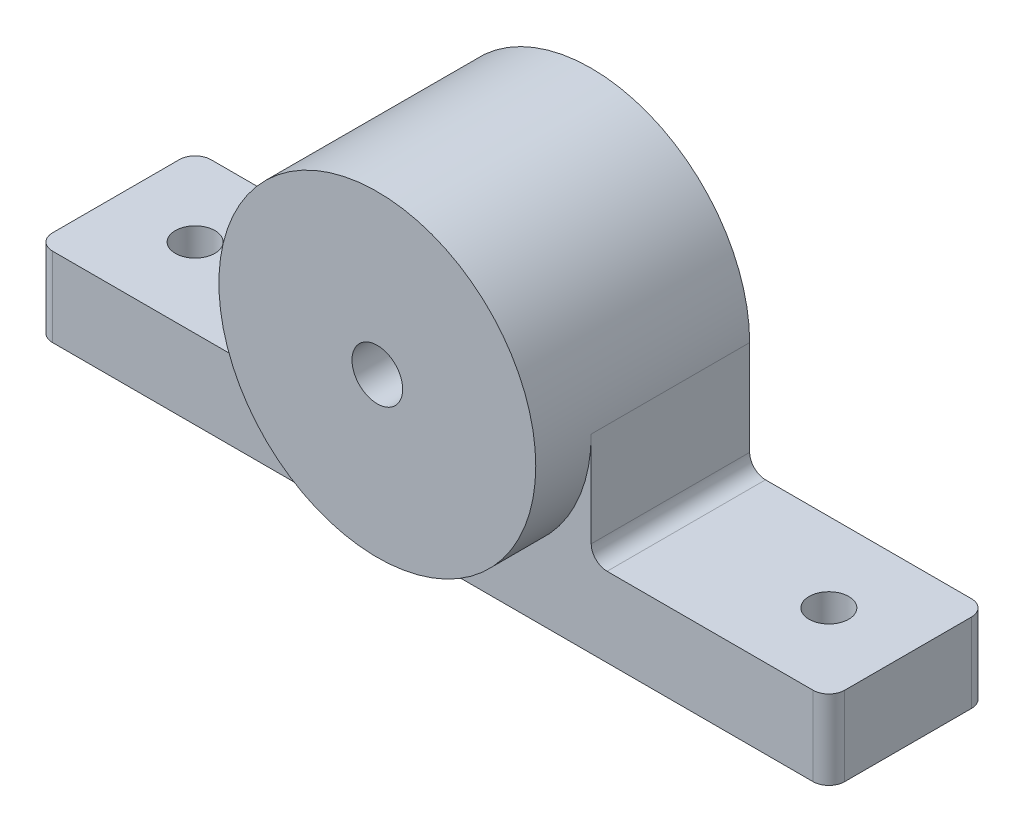
ISO-10303-21;
HEADER;
FILE_DESCRIPTION(('STEP AP214'),'2;1');
FILE_NAME('part.step','',(''),(''),'','','');
FILE_SCHEMA(('AUTOMOTIVE_DESIGN { 1 0 10303 214 1 1 1 1 }'));
ENDSEC;
DATA;
#1=APPLICATION_CONTEXT('core data for automotive mechanical design processes');
#2=APPLICATION_PROTOCOL_DEFINITION('international standard','automotive_design',2000,#1);
#3=PRODUCT_CONTEXT('',#1,'mechanical');
#4=PRODUCT('Part','Part','',(#3));
#5=PRODUCT_RELATED_PRODUCT_CATEGORY('part','',(#4));
#6=PRODUCT_DEFINITION_FORMATION('','',#4);
#7=PRODUCT_DEFINITION_CONTEXT('part definition',#1,'design');
#8=PRODUCT_DEFINITION('design','',#6,#7);
#9=PRODUCT_DEFINITION_SHAPE('','',#8);
#10=(LENGTH_UNIT() NAMED_UNIT(*) SI_UNIT(.MILLI.,.METRE.));
#11=(NAMED_UNIT(*) PLANE_ANGLE_UNIT() SI_UNIT($,.RADIAN.));
#12=(NAMED_UNIT(*) SI_UNIT($,.STERADIAN.) SOLID_ANGLE_UNIT());
#13=UNCERTAINTY_MEASURE_WITH_UNIT(LENGTH_MEASURE(1.E-05),#10,'distance_accuracy_value','');
#14=(GEOMETRIC_REPRESENTATION_CONTEXT(3) GLOBAL_UNCERTAINTY_ASSIGNED_CONTEXT((#13)) GLOBAL_UNIT_ASSIGNED_CONTEXT((#10,
#11,#12)) REPRESENTATION_CONTEXT('',''));
#15=CARTESIAN_POINT('',(0.,0.,0.));
#16=DIRECTION('',(0.,0.,1.));
#17=DIRECTION('',(1.,0.,0.));
#18=AXIS2_PLACEMENT_3D('',#15,#16,#17);
#19=CARTESIAN_POINT('',(0.,0.,0.));
#20=DIRECTION('',(0.,0.,1.));
#21=DIRECTION('',(1.,0.,0.));
#22=AXIS2_PLACEMENT_3D('',#19,#20,#21);
#23=PLANE('',#22);
#24=CARTESIAN_POINT('',(0.,0.,0.));
#25=DIRECTION('',(0.,0.,1.));
#26=DIRECTION('',(1.,0.,0.));
#27=AXIS2_PLACEMENT_3D('',#24,#25,#26);
#28=CIRCLE('',#27,5.);
#29=CARTESIAN_POINT('',(5.,0.,0.));
#30=VERTEX_POINT('',#29);
#31=EDGE_CURVE('E165',#30,#30,#28,.T.);
#32=ORIENTED_EDGE('',*,*,#31,.T.);
#33=EDGE_LOOP('',(#32));
#34=FACE_BOUND('',#33,.T.);
#35=CARTESIAN_POINT('',(0.,0.,0.));
#36=DIRECTION('',(0.,0.,1.));
#37=DIRECTION('',(1.,0.,0.));
#38=AXIS2_PLACEMENT_3D('',#35,#36,#37);
#39=CIRCLE('',#38,6.);
#40=CARTESIAN_POINT('',(6.,0.,0.));
#41=VERTEX_POINT('',#40);
#42=EDGE_CURVE('E164',#41,#41,#39,.T.);
#43=ORIENTED_EDGE('',*,*,#42,.F.);
#44=EDGE_LOOP('',(#43));
#45=FACE_BOUND('',#44,.T.);
#46=ADVANCED_FACE('F38',(#34,#45),#23,.F.);
#47=CARTESIAN_POINT('',(0.,0.,7.));
#48=DIRECTION('',(0.,0.,-1.));
#49=DIRECTION('',(-1.,0.,0.));
#50=AXIS2_PLACEMENT_3D('',#47,#48,#49);
#51=CYLINDRICAL_SURFACE('',#50,5.);
#52=CARTESIAN_POINT('',(0.,0.,7.));
#53=DIRECTION('',(0.,0.,1.));
#54=DIRECTION('',(1.,0.,0.));
#55=AXIS2_PLACEMENT_3D('',#52,#53,#54);
#56=CIRCLE('',#55,5.);
#57=CARTESIAN_POINT('',(5.,0.,7.));
#58=VERTEX_POINT('',#57);
#59=EDGE_CURVE('E173',#58,#58,#56,.T.);
#60=ORIENTED_EDGE('',*,*,#59,.T.);
#61=EDGE_LOOP('',(#60));
#62=FACE_BOUND('',#61,.T.);
#63=ORIENTED_EDGE('',*,*,#31,.F.);
#64=EDGE_LOOP('',(#63));
#65=FACE_BOUND('',#64,.T.);
#66=ADVANCED_FACE('F339',(#62,#65),#51,.F.);
#67=CARTESIAN_POINT('',(0.,0.,7.));
#68=DIRECTION('',(0.,0.,1.));
#69=DIRECTION('',(1.,0.,0.));
#70=AXIS2_PLACEMENT_3D('',#67,#68,#69);
#71=PLANE('',#70);
#72=CARTESIAN_POINT('',(0.,0.,7.));
#73=DIRECTION('',(0.,0.,-1.));
#74=DIRECTION('',(-1.,0.,0.));
#75=AXIS2_PLACEMENT_3D('',#72,#73,#74);
#76=CIRCLE('',#75,1.6);
#77=CARTESIAN_POINT('',(-1.6,0.,7.));
#78=VERTEX_POINT('',#77);
#79=EDGE_CURVE('E262',#78,#78,#76,.T.);
#80=ORIENTED_EDGE('',*,*,#79,.F.);
#81=EDGE_LOOP('',(#80));
#82=FACE_BOUND('',#81,.T.);
#83=ORIENTED_EDGE('',*,*,#59,.F.);
#84=EDGE_LOOP('',(#83));
#85=FACE_BOUND('',#84,.T.);
#86=ADVANCED_FACE('F345',(#82,#85),#71,.F.);
#87=CARTESIAN_POINT('',(0.,0.,8.5));
#88=DIRECTION('',(0.,0.,-1.));
#89=DIRECTION('',(-1.,0.,0.));
#90=AXIS2_PLACEMENT_3D('',#87,#88,#89);
#91=CYLINDRICAL_SURFACE('',#90,6.);
#92=CARTESIAN_POINT('',(0.,0.,-1.5));
#93=DIRECTION('',(0.,0.,-1.));
#94=DIRECTION('',(-1.,0.,0.));
#95=AXIS2_PLACEMENT_3D('',#92,#93,#94);
#96=CIRCLE('',#95,6.);
#97=CARTESIAN_POINT('',(-6.,0.,-1.5));
#98=VERTEX_POINT('',#97);
#99=EDGE_CURVE('E277',#98,#98,#96,.T.);
#100=ORIENTED_EDGE('',*,*,#99,.T.);
#101=EDGE_LOOP('',(#100));
#102=FACE_BOUND('',#101,.T.);
#103=ORIENTED_EDGE('',*,*,#42,.T.);
#104=EDGE_LOOP('',(#103));
#105=FACE_BOUND('',#104,.T.);
#106=ADVANCED_FACE('F508',(#102,#105),#91,.F.);
#107=CARTESIAN_POINT('',(-10.,-12.,8.5));
#108=DIRECTION('',(-1.,0.,0.));
#109=DIRECTION('',(0.,0.,1.));
#110=AXIS2_PLACEMENT_3D('',#107,#108,#109);
#111=PLANE('',#110);
#112=DIRECTION('',(0.,1.,0.));
#113=VECTOR('',#112,1.);
#114=CARTESIAN_POINT('',(-10.,-12.,-1.5));
#115=LINE('',#114,#113);
#116=CARTESIAN_POINT('',(-10.,-6.,-1.5));
#117=VERTEX_POINT('',#116);
#118=CARTESIAN_POINT('',(-10.,0.,-1.5));
#119=VERTEX_POINT('',#118);
#120=EDGE_CURVE('E177',#117,#119,#115,.T.);
#121=ORIENTED_EDGE('',*,*,#120,.F.);
#122=DIRECTION('',(0.,0.,-1.));
#123=VECTOR('',#122,1.);
#124=CARTESIAN_POINT('',(-10.,-6.,8.5));
#125=LINE('',#124,#123);
#126=CARTESIAN_POINT('',(-10.,-6.,8.5));
#127=VERTEX_POINT('',#126);
#128=EDGE_CURVE('E150',#117,#127,#125,.F.);
#129=ORIENTED_EDGE('',*,*,#128,.T.);
#130=DIRECTION('',(0.,1.,0.));
#131=VECTOR('',#130,1.);
#132=CARTESIAN_POINT('',(-10.,-12.,8.5));
#133=LINE('',#132,#131);
#134=CARTESIAN_POINT('',(-10.,0.,8.5));
#135=VERTEX_POINT('',#134);
#136=EDGE_CURVE('E142',#127,#135,#133,.T.);
#137=ORIENTED_EDGE('',*,*,#136,.T.);
#138=DIRECTION('',(0.,0.,-1.));
#139=VECTOR('',#138,1.);
#140=CARTESIAN_POINT('',(-10.,0.,8.5));
#141=LINE('',#140,#139);
#142=EDGE_CURVE('E147',#135,#119,#141,.T.);
#143=ORIENTED_EDGE('',*,*,#142,.T.);
#144=EDGE_LOOP('',(#121,#129,#137,#143));
#145=FACE_BOUND('',#144,.T.);
#146=ADVANCED_FACE('F145',(#145),#111,.T.);
#147=CARTESIAN_POINT('',(10.,-12.,8.5));
#148=DIRECTION('',(0.,-1.,0.));
#149=DIRECTION('',(0.,0.,-1.));
#150=AXIS2_PLACEMENT_3D('',#147,#148,#149);
#151=PLANE('',#150);
#152=CARTESIAN_POINT('',(-20.,-12.,3.5));
#153=DIRECTION('',(0.,-1.,0.));
#154=DIRECTION('',(0.,0.,-1.));
#155=AXIS2_PLACEMENT_3D('',#152,#153,#154);
#156=CIRCLE('',#155,1.25);
#157=CARTESIAN_POINT('',(-20.,-12.,2.25));
#158=VERTEX_POINT('',#157);
#159=EDGE_CURVE('E234',#158,#158,#156,.T.);
#160=ORIENTED_EDGE('',*,*,#159,.F.);
#161=EDGE_LOOP('',(#160));
#162=FACE_BOUND('',#161,.T.);
#163=CARTESIAN_POINT('',(-7.5,-12.,3.5));
#164=DIRECTION('',(0.,-1.,0.));
#165=DIRECTION('',(0.,0.,-1.));
#166=AXIS2_PLACEMENT_3D('',#163,#164,#165);
#167=CIRCLE('',#166,1.25);
#168=CARTESIAN_POINT('',(-7.5,-12.,2.25));
#169=VERTEX_POINT('',#168);
#170=EDGE_CURVE('E240',#169,#169,#167,.T.);
#171=ORIENTED_EDGE('',*,*,#170,.F.);
#172=EDGE_LOOP('',(#171));
#173=FACE_BOUND('',#172,.T.);
#174=CARTESIAN_POINT('',(7.5,-12.,3.5));
#175=DIRECTION('',(0.,-1.,0.));
#176=DIRECTION('',(0.,0.,1.));
#177=AXIS2_PLACEMENT_3D('',#174,#175,#176);
#178=CIRCLE('',#177,1.25);
#179=CARTESIAN_POINT('',(7.5,-12.,4.75));
#180=VERTEX_POINT('',#179);
#181=EDGE_CURVE('E253',#180,#180,#178,.T.);
#182=ORIENTED_EDGE('',*,*,#181,.F.);
#183=EDGE_LOOP('',(#182));
#184=FACE_BOUND('',#183,.T.);
#185=CARTESIAN_POINT('',(20.,-12.,3.50000000000001));
#186=DIRECTION('',(0.,-1.,0.));
#187=DIRECTION('',(0.,0.,1.));
#188=AXIS2_PLACEMENT_3D('',#185,#186,#187);
#189=CIRCLE('',#188,1.25);
#190=CARTESIAN_POINT('',(20.,-12.,4.75000000000001));
#191=VERTEX_POINT('',#190);
#192=EDGE_CURVE('E259',#191,#191,#189,.T.);
#193=ORIENTED_EDGE('',*,*,#192,.F.);
#194=EDGE_LOOP('',(#193));
#195=FACE_BOUND('',#194,.T.);
#196=DIRECTION('',(-1.,0.,0.));
#197=VECTOR('',#196,1.);
#198=CARTESIAN_POINT('',(10.,-12.,8.5));
#199=LINE('',#198,#197);
#200=CARTESIAN_POINT('',(24.,-12.,8.5));
#201=VERTEX_POINT('',#200);
#202=CARTESIAN_POINT('',(-24.,-12.,8.5));
#203=VERTEX_POINT('',#202);
#204=EDGE_CURVE('E154',#201,#203,#199,.T.);
#205=ORIENTED_EDGE('',*,*,#204,.T.);
#206=CARTESIAN_POINT('',(-24.,-12.,7.5));
#207=DIRECTION('',(0.,-1.,0.));
#208=DIRECTION('',(0.,0.,-1.));
#209=AXIS2_PLACEMENT_3D('',#206,#207,#208);
#210=CIRCLE('',#209,1.);
#211=CARTESIAN_POINT('',(-25.,-12.,7.5));
#212=VERTEX_POINT('',#211);
#213=EDGE_CURVE('E63',#203,#212,#210,.T.);
#214=ORIENTED_EDGE('',*,*,#213,.T.);
#215=DIRECTION('',(0.,0.,-1.));
#216=VECTOR('',#215,1.);
#217=CARTESIAN_POINT('',(-25.,-12.,-1.5));
#218=LINE('',#217,#216);
#219=CARTESIAN_POINT('',(-25.,-12.,-0.5));
#220=VERTEX_POINT('',#219);
#221=EDGE_CURVE('E267',#212,#220,#218,.T.);
#222=ORIENTED_EDGE('',*,*,#221,.T.);
#223=CARTESIAN_POINT('',(-24.,-12.,-0.5));
#224=DIRECTION('',(0.,-1.,0.));
#225=DIRECTION('',(0.,0.,-1.));
#226=AXIS2_PLACEMENT_3D('',#223,#224,#225);
#227=CIRCLE('',#226,1.);
#228=CARTESIAN_POINT('',(-24.,-12.,-1.5));
#229=VERTEX_POINT('',#228);
#230=EDGE_CURVE('E55',#220,#229,#227,.T.);
#231=ORIENTED_EDGE('',*,*,#230,.T.);
#232=DIRECTION('',(-1.,0.,0.));
#233=VECTOR('',#232,1.);
#234=CARTESIAN_POINT('',(10.,-12.,-1.5));
#235=LINE('',#234,#233);
#236=CARTESIAN_POINT('',(24.,-12.,-1.5));
#237=VERTEX_POINT('',#236);
#238=EDGE_CURVE('E288',#237,#229,#235,.T.);
#239=ORIENTED_EDGE('',*,*,#238,.F.);
#240=CARTESIAN_POINT('',(24.,-12.,-0.5));
#241=DIRECTION('',(0.,-1.,0.));
#242=DIRECTION('',(0.,0.,-1.));
#243=AXIS2_PLACEMENT_3D('',#240,#241,#242);
#244=CIRCLE('',#243,1.);
#245=CARTESIAN_POINT('',(25.,-12.,-0.5));
#246=VERTEX_POINT('',#245);
#247=EDGE_CURVE('E210',#237,#246,#244,.T.);
#248=ORIENTED_EDGE('',*,*,#247,.T.);
#249=DIRECTION('',(0.,0.,1.));
#250=VECTOR('',#249,1.);
#251=CARTESIAN_POINT('',(25.,-12.,-1.5));
#252=LINE('',#251,#250);
#253=CARTESIAN_POINT('',(25.,-12.,7.5));
#254=VERTEX_POINT('',#253);
#255=EDGE_CURVE('E238',#246,#254,#252,.T.);
#256=ORIENTED_EDGE('',*,*,#255,.T.);
#257=CARTESIAN_POINT('',(24.,-12.,7.5));
#258=DIRECTION('',(0.,-1.,0.));
#259=DIRECTION('',(0.,0.,-1.));
#260=AXIS2_PLACEMENT_3D('',#257,#258,#259);
#261=CIRCLE('',#260,1.);
#262=EDGE_CURVE('E208',#254,#201,#261,.T.);
#263=ORIENTED_EDGE('',*,*,#262,.T.);
#264=EDGE_LOOP('',(#205,#214,#222,#231,#239,#248,#256,#263));
#265=FACE_BOUND('',#264,.T.);
#266=ADVANCED_FACE('F309',(#162,#173,#184,#195,#265),#151,.T.);
#267=CARTESIAN_POINT('',(10.,0.,8.5));
#268=DIRECTION('',(1.,0.,0.));
#269=DIRECTION('',(0.,0.,-1.));
#270=AXIS2_PLACEMENT_3D('',#267,#268,#269);
#271=PLANE('',#270);
#272=DIRECTION('',(0.,-1.,0.));
#273=VECTOR('',#272,1.);
#274=CARTESIAN_POINT('',(10.,0.,8.5));
#275=LINE('',#274,#273);
#276=CARTESIAN_POINT('',(10.,0.,8.5));
#277=VERTEX_POINT('',#276);
#278=CARTESIAN_POINT('',(10.,-6.,8.5));
#279=VERTEX_POINT('',#278);
#280=EDGE_CURVE('E162',#277,#279,#275,.T.);
#281=ORIENTED_EDGE('',*,*,#280,.T.);
#282=DIRECTION('',(0.,0.,1.));
#283=VECTOR('',#282,1.);
#284=CARTESIAN_POINT('',(10.,-6.,-1.5));
#285=LINE('',#284,#283);
#286=CARTESIAN_POINT('',(10.,-6.,-1.5));
#287=VERTEX_POINT('',#286);
#288=EDGE_CURVE('E193',#279,#287,#285,.F.);
#289=ORIENTED_EDGE('',*,*,#288,.T.);
#290=DIRECTION('',(0.,-1.,0.));
#291=VECTOR('',#290,1.);
#292=CARTESIAN_POINT('',(10.,0.,-1.5));
#293=LINE('',#292,#291);
#294=CARTESIAN_POINT('',(10.,0.,-1.5));
#295=VERTEX_POINT('',#294);
#296=EDGE_CURVE('E286',#295,#287,#293,.T.);
#297=ORIENTED_EDGE('',*,*,#296,.F.);
#298=DIRECTION('',(0.,0.,-1.));
#299=VECTOR('',#298,1.);
#300=CARTESIAN_POINT('',(10.,0.,8.5));
#301=LINE('',#300,#299);
#302=EDGE_CURVE('E153',#277,#295,#301,.T.);
#303=ORIENTED_EDGE('',*,*,#302,.F.);
#304=EDGE_LOOP('',(#281,#289,#297,#303));
#305=FACE_BOUND('',#304,.T.);
#306=ADVANCED_FACE('F402',(#305),#271,.T.);
#307=CARTESIAN_POINT('',(0.,0.,8.5));
#308=DIRECTION('',(0.,0.,-1.));
#309=DIRECTION('',(-1.,0.,0.));
#310=AXIS2_PLACEMENT_3D('',#307,#308,#309);
#311=PLANE('',#310);
#312=DIRECTION('',(-1.,0.,0.));
#313=VECTOR('',#312,1.);
#314=CARTESIAN_POINT('',(-25.,-7.,8.5));
#315=LINE('',#314,#313);
#316=CARTESIAN_POINT('',(-11.,-7.,8.5));
#317=VERTEX_POINT('',#316);
#318=CARTESIAN_POINT('',(-24.,-7.,8.5));
#319=VERTEX_POINT('',#318);
#320=EDGE_CURVE('E266',#317,#319,#315,.T.);
#321=ORIENTED_EDGE('',*,*,#320,.T.);
#322=DIRECTION('',(0.,-1.,0.));
#323=VECTOR('',#322,1.);
#324=CARTESIAN_POINT('',(-24.,-12.,8.5));
#325=LINE('',#324,#323);
#326=EDGE_CURVE('E205',#319,#203,#325,.T.);
#327=ORIENTED_EDGE('',*,*,#326,.T.);
#328=ORIENTED_EDGE('',*,*,#204,.F.);
#329=DIRECTION('',(0.,-1.,0.));
#330=VECTOR('',#329,1.);
#331=CARTESIAN_POINT('',(24.,-7.,8.5));
#332=LINE('',#331,#330);
#333=CARTESIAN_POINT('',(24.,-7.,8.5));
#334=VERTEX_POINT('',#333);
#335=EDGE_CURVE('E203',#201,#334,#332,.F.);
#336=ORIENTED_EDGE('',*,*,#335,.T.);
#337=CARTESIAN_POINT('',(11.,-7.,8.5));
#338=VERTEX_POINT('',#337);
#339=EDGE_CURVE('E269',#334,#338,#315,.T.);
#340=ORIENTED_EDGE('',*,*,#339,.T.);
#341=CARTESIAN_POINT('',(11.,-6.,8.5));
#342=DIRECTION('',(0.,0.,-1.));
#343=DIRECTION('',(-1.,0.,0.));
#344=AXIS2_PLACEMENT_3D('',#341,#342,#343);
#345=CIRCLE('',#344,1.);
#346=EDGE_CURVE('E228',#338,#279,#345,.T.);
#347=ORIENTED_EDGE('',*,*,#346,.T.);
#348=ORIENTED_EDGE('',*,*,#280,.F.);
#349=CARTESIAN_POINT('',(0.,0.,8.5));
#350=DIRECTION('',(0.,0.,-1.));
#351=DIRECTION('',(-1.,0.,0.));
#352=AXIS2_PLACEMENT_3D('',#349,#350,#351);
#353=CIRCLE('',#352,10.);
#354=EDGE_CURVE('E158',#277,#135,#353,.T.);
#355=ORIENTED_EDGE('',*,*,#354,.T.);
#356=ORIENTED_EDGE('',*,*,#136,.F.);
#357=CARTESIAN_POINT('',(-11.,-6.,8.5));
#358=DIRECTION('',(0.,0.,-1.));
#359=DIRECTION('',(-1.,0.,0.));
#360=AXIS2_PLACEMENT_3D('',#357,#358,#359);
#361=CIRCLE('',#360,1.);
#362=EDGE_CURVE('E11',#127,#317,#361,.T.);
#363=ORIENTED_EDGE('',*,*,#362,.T.);
#364=EDGE_LOOP('',(#321,#327,#328,#336,#340,#347,#348,#355,#356,#363));
#365=FACE_BOUND('',#364,.T.);
#366=ADVANCED_FACE('F160',(#365),#311,.F.);
#367=CARTESIAN_POINT('',(0.,0.,-1.5));
#368=DIRECTION('',(0.,0.,-1.));
#369=DIRECTION('',(-1.,0.,0.));
#370=AXIS2_PLACEMENT_3D('',#367,#368,#369);
#371=PLANE('',#370);
#372=ORIENTED_EDGE('',*,*,#238,.T.);
#373=DIRECTION('',(0.,-1.,0.));
#374=VECTOR('',#373,1.);
#375=CARTESIAN_POINT('',(-24.,0.,-1.5));
#376=LINE('',#375,#374);
#377=CARTESIAN_POINT('',(-24.,-7.,-1.5));
#378=VERTEX_POINT('',#377);
#379=EDGE_CURVE('E221',#229,#378,#376,.F.);
#380=ORIENTED_EDGE('',*,*,#379,.T.);
#381=DIRECTION('',(1.,0.,0.));
#382=VECTOR('',#381,1.);
#383=CARTESIAN_POINT('',(-25.,-7.,-1.5));
#384=LINE('',#383,#382);
#385=CARTESIAN_POINT('',(-11.,-7.,-1.5));
#386=VERTEX_POINT('',#385);
#387=EDGE_CURVE('E274',#378,#386,#384,.T.);
#388=ORIENTED_EDGE('',*,*,#387,.T.);
#389=CARTESIAN_POINT('',(-11.,-6.,-1.5));
#390=DIRECTION('',(0.,0.,-1.));
#391=DIRECTION('',(-1.,0.,0.));
#392=AXIS2_PLACEMENT_3D('',#389,#390,#391);
#393=CIRCLE('',#392,1.);
#394=EDGE_CURVE('E47',#386,#117,#393,.F.);
#395=ORIENTED_EDGE('',*,*,#394,.T.);
#396=ORIENTED_EDGE('',*,*,#120,.T.);
#397=CARTESIAN_POINT('',(0.,0.,-1.5));
#398=DIRECTION('',(0.,0.,-1.));
#399=DIRECTION('',(-1.,0.,0.));
#400=AXIS2_PLACEMENT_3D('',#397,#398,#399);
#401=CIRCLE('',#400,10.);
#402=EDGE_CURVE('E169',#119,#295,#401,.T.);
#403=ORIENTED_EDGE('',*,*,#402,.T.);
#404=ORIENTED_EDGE('',*,*,#296,.T.);
#405=CARTESIAN_POINT('',(11.,-6.,-1.5));
#406=DIRECTION('',(0.,0.,-1.));
#407=DIRECTION('',(-1.,0.,0.));
#408=AXIS2_PLACEMENT_3D('',#405,#406,#407);
#409=CIRCLE('',#408,1.);
#410=CARTESIAN_POINT('',(11.,-7.,-1.5));
#411=VERTEX_POINT('',#410);
#412=EDGE_CURVE('E230',#287,#411,#409,.F.);
#413=ORIENTED_EDGE('',*,*,#412,.T.);
#414=CARTESIAN_POINT('',(24.,-7.,-1.5));
#415=VERTEX_POINT('',#414);
#416=EDGE_CURVE('E273',#411,#415,#384,.T.);
#417=ORIENTED_EDGE('',*,*,#416,.T.);
#418=DIRECTION('',(0.,-1.,0.));
#419=VECTOR('',#418,1.);
#420=CARTESIAN_POINT('',(24.,0.,-1.5));
#421=LINE('',#420,#419);
#422=EDGE_CURVE('E218',#415,#237,#421,.T.);
#423=ORIENTED_EDGE('',*,*,#422,.T.);
#424=EDGE_LOOP('',(#372,#380,#388,#395,#396,#403,#404,#413,#417,#423));
#425=FACE_BOUND('',#424,.T.);
#426=ORIENTED_EDGE('',*,*,#99,.F.);
#427=EDGE_LOOP('',(#426));
#428=FACE_BOUND('',#427,.T.);
#429=ADVANCED_FACE('F292',(#425,#428),#371,.T.);
#430=CARTESIAN_POINT('',(0.,0.,12.));
#431=DIRECTION('',(0.,0.,1.));
#432=DIRECTION('',(1.,0.,0.));
#433=AXIS2_PLACEMENT_3D('',#430,#431,#432);
#434=PLANE('',#433);
#435=CARTESIAN_POINT('',(0.,0.,12.));
#436=DIRECTION('',(0.,0.,1.));
#437=DIRECTION('',(1.,0.,0.));
#438=AXIS2_PLACEMENT_3D('',#435,#436,#437);
#439=CIRCLE('',#438,1.6);
#440=CARTESIAN_POINT('',(1.6,0.,12.));
#441=VERTEX_POINT('',#440);
#442=EDGE_CURVE('E248',#441,#441,#439,.F.);
#443=ORIENTED_EDGE('',*,*,#442,.T.);
#444=EDGE_LOOP('',(#443));
#445=FACE_BOUND('',#444,.T.);
#446=CARTESIAN_POINT('',(0.,0.,12.));
#447=DIRECTION('',(0.,0.,1.));
#448=DIRECTION('',(1.,0.,0.));
#449=AXIS2_PLACEMENT_3D('',#446,#447,#448);
#450=CIRCLE('',#449,10.);
#451=CARTESIAN_POINT('',(10.,0.,12.));
#452=VERTEX_POINT('',#451);
#453=EDGE_CURVE('E170',#452,#452,#450,.T.);
#454=ORIENTED_EDGE('',*,*,#453,.T.);
#455=EDGE_LOOP('',(#454));
#456=FACE_BOUND('',#455,.T.);
#457=ADVANCED_FACE('F353',(#445,#456),#434,.T.);
#458=CARTESIAN_POINT('',(0.,0.,7.));
#459=DIRECTION('',(0.,0.,-1.));
#460=DIRECTION('',(-1.,0.,0.));
#461=AXIS2_PLACEMENT_3D('',#458,#459,#460);
#462=CYLINDRICAL_SURFACE('',#461,10.);
#463=ORIENTED_EDGE('',*,*,#453,.F.);
#464=EDGE_LOOP('',(#463));
#465=FACE_BOUND('',#464,.T.);
#466=ORIENTED_EDGE('',*,*,#354,.F.);
#467=ORIENTED_EDGE('',*,*,#302,.T.);
#468=ORIENTED_EDGE('',*,*,#402,.F.);
#469=ORIENTED_EDGE('',*,*,#142,.F.);
#470=EDGE_LOOP('',(#466,#467,#468,#469));
#471=FACE_BOUND('',#470,.T.);
#472=ADVANCED_FACE('F167',(#465,#471),#462,.T.);
#473=CARTESIAN_POINT('',(25.,-7.,-1.5));
#474=DIRECTION('',(1.,0.,0.));
#475=DIRECTION('',(0.,0.,-1.));
#476=AXIS2_PLACEMENT_3D('',#473,#474,#475);
#477=PLANE('',#476);
#478=ORIENTED_EDGE('',*,*,#255,.F.);
#479=DIRECTION('',(0.,-1.,0.));
#480=VECTOR('',#479,1.);
#481=CARTESIAN_POINT('',(25.,-7.,-0.5));
#482=LINE('',#481,#480);
#483=CARTESIAN_POINT('',(25.,-7.,-0.5));
#484=VERTEX_POINT('',#483);
#485=EDGE_CURVE('E226',#246,#484,#482,.F.);
#486=ORIENTED_EDGE('',*,*,#485,.T.);
#487=DIRECTION('',(0.,0.,1.));
#488=VECTOR('',#487,1.);
#489=CARTESIAN_POINT('',(25.,-7.,-1.5));
#490=LINE('',#489,#488);
#491=CARTESIAN_POINT('',(25.,-7.,7.5));
#492=VERTEX_POINT('',#491);
#493=EDGE_CURVE('E263',#484,#492,#490,.T.);
#494=ORIENTED_EDGE('',*,*,#493,.T.);
#495=DIRECTION('',(0.,-1.,0.));
#496=VECTOR('',#495,1.);
#497=CARTESIAN_POINT('',(25.,-12.,7.5));
#498=LINE('',#497,#496);
#499=EDGE_CURVE('E223',#492,#254,#498,.T.);
#500=ORIENTED_EDGE('',*,*,#499,.T.);
#501=EDGE_LOOP('',(#478,#486,#494,#500));
#502=FACE_BOUND('',#501,.T.);
#503=ADVANCED_FACE('F315',(#502),#477,.T.);
#504=CARTESIAN_POINT('',(0.,-7.,0.));
#505=DIRECTION('',(0.,1.,0.));
#506=DIRECTION('',(0.,0.,1.));
#507=AXIS2_PLACEMENT_3D('',#504,#505,#506);
#508=PLANE('',#507);
#509=CARTESIAN_POINT('',(20.,-7.,3.50000000000001));
#510=DIRECTION('',(0.,1.,0.));
#511=DIRECTION('',(0.,0.,1.));
#512=AXIS2_PLACEMENT_3D('',#509,#510,#511);
#513=CIRCLE('',#512,1.25);
#514=CARTESIAN_POINT('',(20.,-7.,4.75000000000001));
#515=VERTEX_POINT('',#514);
#516=EDGE_CURVE('E42',#515,#515,#513,.T.);
#517=ORIENTED_EDGE('',*,*,#516,.F.);
#518=EDGE_LOOP('',(#517));
#519=FACE_BOUND('',#518,.T.);
#520=ORIENTED_EDGE('',*,*,#416,.F.);
#521=DIRECTION('',(0.,0.,1.));
#522=VECTOR('',#521,1.);
#523=CARTESIAN_POINT('',(11.,-7.,8.5));
#524=LINE('',#523,#522);
#525=EDGE_CURVE('E190',#411,#338,#524,.T.);
#526=ORIENTED_EDGE('',*,*,#525,.T.);
#527=ORIENTED_EDGE('',*,*,#339,.F.);
#528=CARTESIAN_POINT('',(24.,-7.,7.5));
#529=DIRECTION('',(0.,1.,0.));
#530=DIRECTION('',(0.,0.,1.));
#531=AXIS2_PLACEMENT_3D('',#528,#529,#530);
#532=CIRCLE('',#531,1.);
#533=EDGE_CURVE('E186',#334,#492,#532,.T.);
#534=ORIENTED_EDGE('',*,*,#533,.T.);
#535=ORIENTED_EDGE('',*,*,#493,.F.);
#536=CARTESIAN_POINT('',(24.,-7.,-0.5));
#537=DIRECTION('',(0.,1.,0.));
#538=DIRECTION('',(0.,0.,1.));
#539=AXIS2_PLACEMENT_3D('',#536,#537,#538);
#540=CIRCLE('',#539,1.);
#541=EDGE_CURVE('E188',#484,#415,#540,.T.);
#542=ORIENTED_EDGE('',*,*,#541,.T.);
#543=EDGE_LOOP('',(#520,#526,#527,#534,#535,#542));
#544=FACE_BOUND('',#543,.T.);
#545=ADVANCED_FACE('F321',(#519,#544),#508,.T.);
#546=CARTESIAN_POINT('',(-20.,-7.,3.5));
#547=DIRECTION('',(0.,1.,0.));
#548=DIRECTION('',(0.,0.,1.));
#549=AXIS2_PLACEMENT_3D('',#546,#547,#548);
#550=CIRCLE('',#549,1.25);
#551=CARTESIAN_POINT('',(-20.,-7.,4.75));
#552=VERTEX_POINT('',#551);
#553=EDGE_CURVE('E232',#552,#552,#550,.T.);
#554=ORIENTED_EDGE('',*,*,#553,.F.);
#555=EDGE_LOOP('',(#554));
#556=FACE_BOUND('',#555,.T.);
#557=ORIENTED_EDGE('',*,*,#320,.F.);
#558=DIRECTION('',(0.,0.,-1.));
#559=VECTOR('',#558,1.);
#560=CARTESIAN_POINT('',(-11.,-7.,-1.5));
#561=LINE('',#560,#559);
#562=EDGE_CURVE('E199',#317,#386,#561,.T.);
#563=ORIENTED_EDGE('',*,*,#562,.T.);
#564=ORIENTED_EDGE('',*,*,#387,.F.);
#565=CARTESIAN_POINT('',(-24.,-7.,-0.5));
#566=DIRECTION('',(0.,1.,0.));
#567=DIRECTION('',(0.,0.,1.));
#568=AXIS2_PLACEMENT_3D('',#565,#566,#567);
#569=CIRCLE('',#568,1.);
#570=CARTESIAN_POINT('',(-25.,-7.,-0.5));
#571=VERTEX_POINT('',#570);
#572=EDGE_CURVE('E195',#378,#571,#569,.T.);
#573=ORIENTED_EDGE('',*,*,#572,.T.);
#574=DIRECTION('',(0.,0.,-1.));
#575=VECTOR('',#574,1.);
#576=CARTESIAN_POINT('',(-25.,-7.,-1.5));
#577=LINE('',#576,#575);
#578=CARTESIAN_POINT('',(-25.,-7.,7.5));
#579=VERTEX_POINT('',#578);
#580=EDGE_CURVE('E270',#579,#571,#577,.T.);
#581=ORIENTED_EDGE('',*,*,#580,.F.);
#582=CARTESIAN_POINT('',(-24.,-7.,7.5));
#583=DIRECTION('',(0.,1.,0.));
#584=DIRECTION('',(0.,0.,1.));
#585=AXIS2_PLACEMENT_3D('',#582,#583,#584);
#586=CIRCLE('',#585,1.);
#587=EDGE_CURVE('E197',#579,#319,#586,.T.);
#588=ORIENTED_EDGE('',*,*,#587,.T.);
#589=EDGE_LOOP('',(#557,#563,#564,#573,#581,#588));
#590=FACE_BOUND('',#589,.T.);
#591=ADVANCED_FACE('F300',(#556,#590),#508,.T.);
#592=CARTESIAN_POINT('',(-25.,-7.,-1.5));
#593=DIRECTION('',(-1.,0.,0.));
#594=DIRECTION('',(0.,0.,1.));
#595=AXIS2_PLACEMENT_3D('',#592,#593,#594);
#596=PLANE('',#595);
#597=ORIENTED_EDGE('',*,*,#221,.F.);
#598=DIRECTION('',(0.,-1.,0.));
#599=VECTOR('',#598,1.);
#600=CARTESIAN_POINT('',(-25.,-7.,7.5));
#601=LINE('',#600,#599);
#602=EDGE_CURVE('E216',#212,#579,#601,.F.);
#603=ORIENTED_EDGE('',*,*,#602,.T.);
#604=ORIENTED_EDGE('',*,*,#580,.T.);
#605=DIRECTION('',(0.,-1.,0.));
#606=VECTOR('',#605,1.);
#607=CARTESIAN_POINT('',(-25.,-7.,-0.5));
#608=LINE('',#607,#606);
#609=EDGE_CURVE('E214',#571,#220,#608,.T.);
#610=ORIENTED_EDGE('',*,*,#609,.T.);
#611=EDGE_LOOP('',(#597,#603,#604,#610));
#612=FACE_BOUND('',#611,.T.);
#613=ADVANCED_FACE('F328',(#612),#596,.T.);
#614=CARTESIAN_POINT('',(11.,-6.,0.));
#615=DIRECTION('',(0.,0.,-1.));
#616=DIRECTION('',(-1.,0.,0.));
#617=AXIS2_PLACEMENT_3D('',#614,#615,#616);
#618=CYLINDRICAL_SURFACE('',#617,1.);
#619=ORIENTED_EDGE('',*,*,#412,.F.);
#620=ORIENTED_EDGE('',*,*,#288,.F.);
#621=ORIENTED_EDGE('',*,*,#346,.F.);
#622=ORIENTED_EDGE('',*,*,#525,.F.);
#623=EDGE_LOOP('',(#619,#620,#621,#622));
#624=FACE_BOUND('',#623,.T.);
#625=ADVANCED_FACE('F355',(#624),#618,.F.);
#626=CARTESIAN_POINT('',(-11.,-6.,0.));
#627=DIRECTION('',(0.,0.,1.));
#628=DIRECTION('',(1.,0.,0.));
#629=AXIS2_PLACEMENT_3D('',#626,#627,#628);
#630=CYLINDRICAL_SURFACE('',#629,1.);
#631=ORIENTED_EDGE('',*,*,#362,.F.);
#632=ORIENTED_EDGE('',*,*,#128,.F.);
#633=ORIENTED_EDGE('',*,*,#394,.F.);
#634=ORIENTED_EDGE('',*,*,#562,.F.);
#635=EDGE_LOOP('',(#631,#632,#633,#634));
#636=FACE_BOUND('',#635,.T.);
#637=ADVANCED_FACE('F295',(#636),#630,.F.);
#638=CARTESIAN_POINT('',(-24.,0.,7.5));
#639=DIRECTION('',(0.,1.,0.));
#640=DIRECTION('',(0.,0.,1.));
#641=AXIS2_PLACEMENT_3D('',#638,#639,#640);
#642=CYLINDRICAL_SURFACE('',#641,1.);
#643=ORIENTED_EDGE('',*,*,#587,.F.);
#644=ORIENTED_EDGE('',*,*,#602,.F.);
#645=ORIENTED_EDGE('',*,*,#213,.F.);
#646=ORIENTED_EDGE('',*,*,#326,.F.);
#647=EDGE_LOOP('',(#643,#644,#645,#646));
#648=FACE_BOUND('',#647,.T.);
#649=ADVANCED_FACE('F306',(#648),#642,.T.);
#650=CARTESIAN_POINT('',(-24.,-7.,-0.5));
#651=DIRECTION('',(0.,-1.,0.));
#652=DIRECTION('',(0.,0.,-1.));
#653=AXIS2_PLACEMENT_3D('',#650,#651,#652);
#654=CYLINDRICAL_SURFACE('',#653,1.);
#655=ORIENTED_EDGE('',*,*,#572,.F.);
#656=ORIENTED_EDGE('',*,*,#379,.F.);
#657=ORIENTED_EDGE('',*,*,#230,.F.);
#658=ORIENTED_EDGE('',*,*,#609,.F.);
#659=EDGE_LOOP('',(#655,#656,#657,#658));
#660=FACE_BOUND('',#659,.T.);
#661=ADVANCED_FACE('F330',(#660),#654,.T.);
#662=CARTESIAN_POINT('',(24.,0.,-0.5));
#663=DIRECTION('',(0.,-1.,0.));
#664=DIRECTION('',(0.,0.,-1.));
#665=AXIS2_PLACEMENT_3D('',#662,#663,#664);
#666=CYLINDRICAL_SURFACE('',#665,1.);
#667=ORIENTED_EDGE('',*,*,#541,.F.);
#668=ORIENTED_EDGE('',*,*,#485,.F.);
#669=ORIENTED_EDGE('',*,*,#247,.F.);
#670=ORIENTED_EDGE('',*,*,#422,.F.);
#671=EDGE_LOOP('',(#667,#668,#669,#670));
#672=FACE_BOUND('',#671,.T.);
#673=ADVANCED_FACE('F326',(#672),#666,.T.);
#674=CARTESIAN_POINT('',(24.,-7.,7.5));
#675=DIRECTION('',(0.,1.,0.));
#676=DIRECTION('',(0.,0.,1.));
#677=AXIS2_PLACEMENT_3D('',#674,#675,#676);
#678=CYLINDRICAL_SURFACE('',#677,1.);
#679=ORIENTED_EDGE('',*,*,#533,.F.);
#680=ORIENTED_EDGE('',*,*,#335,.F.);
#681=ORIENTED_EDGE('',*,*,#262,.F.);
#682=ORIENTED_EDGE('',*,*,#499,.F.);
#683=EDGE_LOOP('',(#679,#680,#681,#682));
#684=FACE_BOUND('',#683,.T.);
#685=ADVANCED_FACE('F40',(#684),#678,.T.);
#686=CARTESIAN_POINT('',(-20.,-2.,3.5));
#687=DIRECTION('',(0.,-1.,0.));
#688=DIRECTION('',(0.,0.,-1.));
#689=AXIS2_PLACEMENT_3D('',#686,#687,#688);
#690=CYLINDRICAL_SURFACE('',#689,1.25);
#691=ORIENTED_EDGE('',*,*,#553,.T.);
#692=EDGE_LOOP('',(#691));
#693=FACE_BOUND('',#692,.T.);
#694=ORIENTED_EDGE('',*,*,#159,.T.);
#695=EDGE_LOOP('',(#694));
#696=FACE_BOUND('',#695,.T.);
#697=ADVANCED_FACE('F391',(#693,#696),#690,.F.);
#698=CARTESIAN_POINT('',(20.,-2.,3.50000000000001));
#699=DIRECTION('',(0.,-1.,0.));
#700=DIRECTION('',(0.,0.,-1.));
#701=AXIS2_PLACEMENT_3D('',#698,#699,#700);
#702=CYLINDRICAL_SURFACE('',#701,1.25);
#703=ORIENTED_EDGE('',*,*,#516,.T.);
#704=EDGE_LOOP('',(#703));
#705=FACE_BOUND('',#704,.T.);
#706=ORIENTED_EDGE('',*,*,#192,.T.);
#707=EDGE_LOOP('',(#706));
#708=FACE_BOUND('',#707,.T.);
#709=ADVANCED_FACE('F438',(#705,#708),#702,.F.);
#710=CARTESIAN_POINT('',(7.5,-2.,3.5));
#711=DIRECTION('',(0.,-1.,0.));
#712=DIRECTION('',(0.,0.,-1.));
#713=AXIS2_PLACEMENT_3D('',#710,#711,#712);
#714=CYLINDRICAL_SURFACE('',#713,1.25);
#715=CARTESIAN_POINT('',(7.5,-2.,3.5));
#716=DIRECTION('',(0.,-1.,0.));
#717=DIRECTION('',(0.,0.,1.));
#718=AXIS2_PLACEMENT_3D('',#715,#716,#717);
#719=CIRCLE('',#718,1.25);
#720=CARTESIAN_POINT('',(7.5,-2.,4.75));
#721=VERTEX_POINT('',#720);
#722=EDGE_CURVE('E256',#721,#721,#719,.T.);
#723=ORIENTED_EDGE('',*,*,#722,.F.);
#724=EDGE_LOOP('',(#723));
#725=FACE_BOUND('',#724,.T.);
#726=ORIENTED_EDGE('',*,*,#181,.T.);
#727=EDGE_LOOP('',(#726));
#728=FACE_BOUND('',#727,.T.);
#729=ADVANCED_FACE('F450',(#725,#728),#714,.F.);
#730=CARTESIAN_POINT('',(7.5,-2.,3.5));
#731=DIRECTION('',(0.,1.,0.));
#732=DIRECTION('',(0.,0.,1.));
#733=AXIS2_PLACEMENT_3D('',#730,#731,#732);
#734=PLANE('',#733);
#735=ORIENTED_EDGE('',*,*,#722,.T.);
#736=EDGE_LOOP('',(#735));
#737=FACE_BOUND('',#736,.T.);
#738=ADVANCED_FACE('F462',(#737),#734,.F.);
#739=CARTESIAN_POINT('',(-7.5,-2.,3.5));
#740=DIRECTION('',(0.,-1.,0.));
#741=DIRECTION('',(0.,0.,-1.));
#742=AXIS2_PLACEMENT_3D('',#739,#740,#741);
#743=CYLINDRICAL_SURFACE('',#742,1.25);
#744=CARTESIAN_POINT('',(-7.5,-2.,3.5));
#745=DIRECTION('',(0.,-1.,0.));
#746=DIRECTION('',(0.,0.,-1.));
#747=AXIS2_PLACEMENT_3D('',#744,#745,#746);
#748=CIRCLE('',#747,1.25);
#749=CARTESIAN_POINT('',(-7.5,-2.,2.25));
#750=VERTEX_POINT('',#749);
#751=EDGE_CURVE('E245',#750,#750,#748,.T.);
#752=ORIENTED_EDGE('',*,*,#751,.F.);
#753=EDGE_LOOP('',(#752));
#754=FACE_BOUND('',#753,.T.);
#755=ORIENTED_EDGE('',*,*,#170,.T.);
#756=EDGE_LOOP('',(#755));
#757=FACE_BOUND('',#756,.T.);
#758=ADVANCED_FACE('F473',(#754,#757),#743,.F.);
#759=CARTESIAN_POINT('',(-7.5,-2.,3.5));
#760=DIRECTION('',(0.,-1.,0.));
#761=DIRECTION('',(0.,0.,-1.));
#762=AXIS2_PLACEMENT_3D('',#759,#760,#761);
#763=PLANE('',#762);
#764=ORIENTED_EDGE('',*,*,#751,.T.);
#765=EDGE_LOOP('',(#764));
#766=FACE_BOUND('',#765,.T.);
#767=ADVANCED_FACE('F484',(#766),#763,.T.);
#768=CARTESIAN_POINT('',(0.,0.,12.001));
#769=DIRECTION('',(0.,0.,-1.));
#770=DIRECTION('',(-1.,0.,0.));
#771=AXIS2_PLACEMENT_3D('',#768,#769,#770);
#772=CYLINDRICAL_SURFACE('',#771,1.6);
#773=ORIENTED_EDGE('',*,*,#442,.F.);
#774=EDGE_LOOP('',(#773));
#775=FACE_BOUND('',#774,.T.);
#776=ORIENTED_EDGE('',*,*,#79,.T.);
#777=EDGE_LOOP('',(#776));
#778=FACE_BOUND('',#777,.T.);
#779=ADVANCED_FACE('F495',(#775,#778),#772,.F.);
#780=CLOSED_SHELL('',(#46,#66,#86,#106,#146,#266,#306,#366,#429,#457,#472,#503,#545,#591,#613,
#625,#637,#649,#661,#673,#685,#697,#709,#729,#738,#758,#767,#779));
#781=MANIFOLD_SOLID_BREP('B2',#780);
#782=ADVANCED_BREP_SHAPE_REPRESENTATION('',(#18,#781),#14);
#783=SHAPE_DEFINITION_REPRESENTATION(#9,#782);
ENDSEC;
END-ISO-10303-21;
